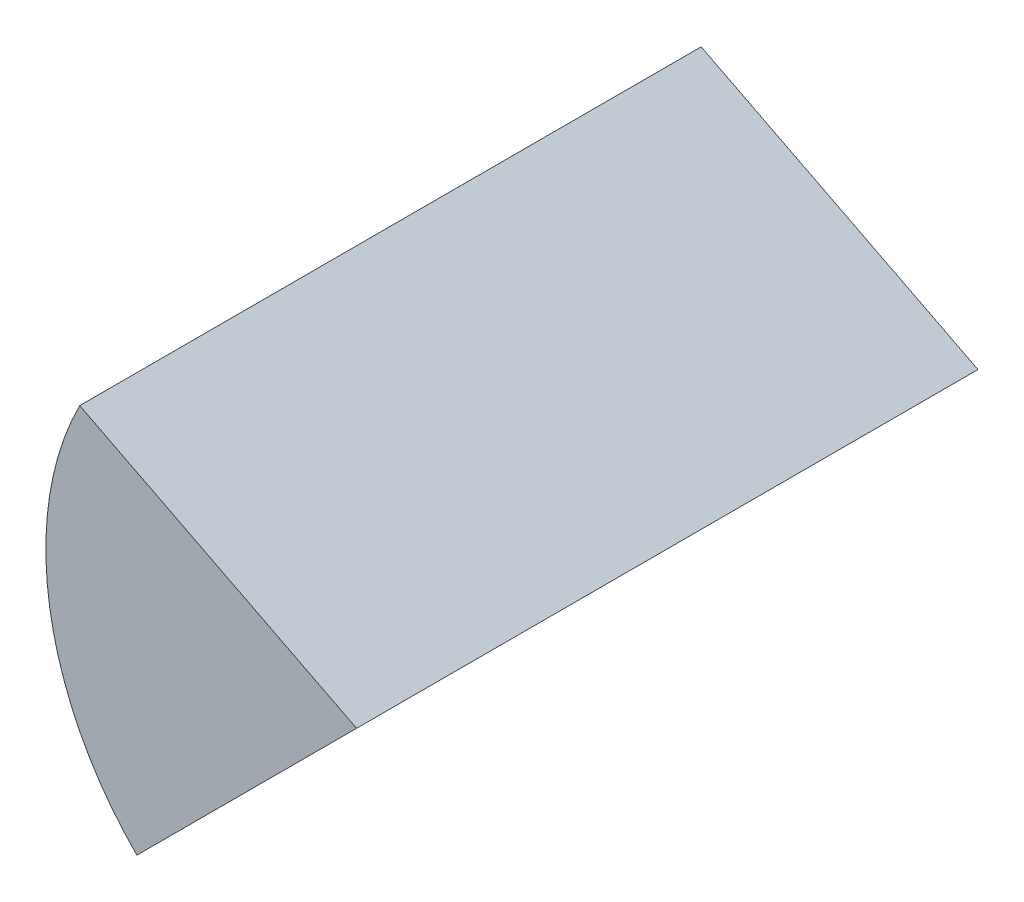
ISO-10303-21;
HEADER;
FILE_DESCRIPTION(('STEP AP214'),'2;1');
FILE_NAME('part.step','',(''),(''),'','','');
FILE_SCHEMA(('AUTOMOTIVE_DESIGN { 1 0 10303 214 1 1 1 1 }'));
ENDSEC;
DATA;
#1=APPLICATION_CONTEXT('core data for automotive mechanical design processes');
#2=APPLICATION_PROTOCOL_DEFINITION('international standard','automotive_design',2000,#1);
#3=PRODUCT_CONTEXT('',#1,'mechanical');
#4=PRODUCT('Part','Part','',(#3));
#5=PRODUCT_RELATED_PRODUCT_CATEGORY('part','',(#4));
#6=PRODUCT_DEFINITION_FORMATION('','',#4);
#7=PRODUCT_DEFINITION_CONTEXT('part definition',#1,'design');
#8=PRODUCT_DEFINITION('design','',#6,#7);
#9=PRODUCT_DEFINITION_SHAPE('','',#8);
#10=(LENGTH_UNIT() NAMED_UNIT(*) SI_UNIT(.MILLI.,.METRE.));
#11=(NAMED_UNIT(*) PLANE_ANGLE_UNIT() SI_UNIT($,.RADIAN.));
#12=(NAMED_UNIT(*) SI_UNIT($,.STERADIAN.) SOLID_ANGLE_UNIT());
#13=UNCERTAINTY_MEASURE_WITH_UNIT(LENGTH_MEASURE(1.E-05),#10,'distance_accuracy_value','');
#14=(GEOMETRIC_REPRESENTATION_CONTEXT(3) GLOBAL_UNCERTAINTY_ASSIGNED_CONTEXT((#13)) GLOBAL_UNIT_ASSIGNED_CONTEXT((#10,
#11,#12)) REPRESENTATION_CONTEXT('',''));
#15=CARTESIAN_POINT('',(0.,0.,0.));
#16=DIRECTION('',(0.,0.,1.));
#17=DIRECTION('',(1.,0.,0.));
#18=AXIS2_PLACEMENT_3D('',#15,#16,#17);
#19=CARTESIAN_POINT('',(0.,0.,50.));
#20=DIRECTION('',(-0.707106781186554,0.707106781186541,0.));
#21=DIRECTION('',(-0.707106781186541,-0.707106781186554,0.));
#22=AXIS2_PLACEMENT_3D('',#19,#20,#21);
#23=PLANE('',#22);
#24=DIRECTION('',(0.707106781186541,0.707106781186554,0.));
#25=VECTOR('',#24,1.);
#26=CARTESIAN_POINT('',(0.,0.,0.));
#27=LINE('',#26,#25);
#28=CARTESIAN_POINT('',(-17.6776695296635,-17.6776695296638,0.));
#29=VERTEX_POINT('',#28);
#30=CARTESIAN_POINT('',(0.,0.,0.));
#31=VERTEX_POINT('',#30);
#32=EDGE_CURVE('E80',#29,#31,#27,.T.);
#33=ORIENTED_EDGE('',*,*,#32,.T.);
#34=DIRECTION('',(0.,0.,-1.));
#35=VECTOR('',#34,1.);
#36=CARTESIAN_POINT('',(0.,0.,50.));
#37=LINE('',#36,#35);
#38=CARTESIAN_POINT('',(0.,0.,50.));
#39=VERTEX_POINT('',#38);
#40=EDGE_CURVE('E11',#39,#31,#37,.T.);
#41=ORIENTED_EDGE('',*,*,#40,.F.);
#42=DIRECTION('',(0.707106781186541,0.707106781186554,0.));
#43=VECTOR('',#42,1.);
#44=CARTESIAN_POINT('',(0.,0.,50.));
#45=LINE('',#44,#43);
#46=CARTESIAN_POINT('',(-17.6776695296635,-17.6776695296638,50.));
#47=VERTEX_POINT('',#46);
#48=EDGE_CURVE('E73',#47,#39,#45,.T.);
#49=ORIENTED_EDGE('',*,*,#48,.F.);
#50=DIRECTION('',(0.,0.,-1.));
#51=VECTOR('',#50,1.);
#52=CARTESIAN_POINT('',(-17.6776695296635,-17.6776695296638,50.));
#53=LINE('',#52,#51);
#54=EDGE_CURVE('E81',#47,#29,#53,.T.);
#55=ORIENTED_EDGE('',*,*,#54,.T.);
#56=EDGE_LOOP('',(#33,#41,#49,#55));
#57=FACE_BOUND('',#56,.T.);
#58=ADVANCED_FACE('F33',(#57),#23,.F.);
#59=CARTESIAN_POINT('',(0.,0.,50.));
#60=DIRECTION('',(-0.453990499739549,-0.891006524188367,0.));
#61=DIRECTION('',(0.891006524188367,-0.453990499739549,0.));
#62=AXIS2_PLACEMENT_3D('',#59,#60,#61);
#63=PLANE('',#62);
#64=DIRECTION('',(-0.891006524188367,0.453990499739549,0.));
#65=VECTOR('',#64,1.);
#66=CARTESIAN_POINT('',(0.,0.,0.));
#67=LINE('',#66,#65);
#68=CARTESIAN_POINT('',(-22.2751631047092,11.3497624934887,0.));
#69=VERTEX_POINT('',#68);
#70=EDGE_CURVE('E61',#31,#69,#67,.T.);
#71=ORIENTED_EDGE('',*,*,#70,.T.);
#72=DIRECTION('',(0.,0.,-1.));
#73=VECTOR('',#72,1.);
#74=CARTESIAN_POINT('',(-22.2751631047092,11.3497624934887,50.));
#75=LINE('',#74,#73);
#76=CARTESIAN_POINT('',(-22.2751631047092,11.3497624934887,50.));
#77=VERTEX_POINT('',#76);
#78=EDGE_CURVE('E41',#77,#69,#75,.T.);
#79=ORIENTED_EDGE('',*,*,#78,.F.);
#80=DIRECTION('',(-0.891006524188367,0.453990499739549,0.));
#81=VECTOR('',#80,1.);
#82=CARTESIAN_POINT('',(0.,0.,50.));
#83=LINE('',#82,#81);
#84=EDGE_CURVE('E69',#39,#77,#83,.T.);
#85=ORIENTED_EDGE('',*,*,#84,.F.);
#86=ORIENTED_EDGE('',*,*,#40,.T.);
#87=EDGE_LOOP('',(#71,#79,#85,#86));
#88=FACE_BOUND('',#87,.T.);
#89=ADVANCED_FACE('F70',(#88),#63,.F.);
#90=CARTESIAN_POINT('',(0.,0.,50.));
#91=DIRECTION('',(0.,0.,-1.));
#92=DIRECTION('',(-1.,0.,0.));
#93=AXIS2_PLACEMENT_3D('',#90,#91,#92);
#94=CYLINDRICAL_SURFACE('',#93,25.);
#95=CARTESIAN_POINT('',(0.,0.,0.));
#96=DIRECTION('',(0.,0.,1.));
#97=DIRECTION('',(1.,0.,0.));
#98=AXIS2_PLACEMENT_3D('',#95,#96,#97);
#99=CIRCLE('',#98,25.);
#100=EDGE_CURVE('E66',#69,#29,#99,.T.);
#101=ORIENTED_EDGE('',*,*,#100,.T.);
#102=ORIENTED_EDGE('',*,*,#54,.F.);
#103=CARTESIAN_POINT('',(0.,0.,50.));
#104=DIRECTION('',(0.,0.,1.));
#105=DIRECTION('',(1.,0.,0.));
#106=AXIS2_PLACEMENT_3D('',#103,#104,#105);
#107=CIRCLE('',#106,25.);
#108=EDGE_CURVE('E49',#77,#47,#107,.T.);
#109=ORIENTED_EDGE('',*,*,#108,.F.);
#110=ORIENTED_EDGE('',*,*,#78,.T.);
#111=EDGE_LOOP('',(#101,#102,#109,#110));
#112=FACE_BOUND('',#111,.T.);
#113=ADVANCED_FACE('F92',(#112),#94,.T.);
#114=CARTESIAN_POINT('',(0.,0.,50.));
#115=DIRECTION('',(0.,0.,1.));
#116=DIRECTION('',(1.,0.,0.));
#117=AXIS2_PLACEMENT_3D('',#114,#115,#116);
#118=PLANE('',#117);
#119=ORIENTED_EDGE('',*,*,#48,.T.);
#120=ORIENTED_EDGE('',*,*,#84,.T.);
#121=ORIENTED_EDGE('',*,*,#108,.T.);
#122=EDGE_LOOP('',(#119,#120,#121));
#123=FACE_BOUND('',#122,.T.);
#124=ADVANCED_FACE('F76',(#123),#118,.T.);
#125=CARTESIAN_POINT('',(0.,0.,0.));
#126=DIRECTION('',(0.,0.,1.));
#127=DIRECTION('',(1.,0.,0.));
#128=AXIS2_PLACEMENT_3D('',#125,#126,#127);
#129=PLANE('',#128);
#130=CARTESIAN_POINT('',(-15.3095553071056,-2.47933613383273,0.));
#131=DIRECTION('',(0.,0.,-1.));
#132=DIRECTION('',(-1.,0.,0.));
#133=AXIS2_PLACEMENT_3D('',#130,#131,#132);
#134=CIRCLE('',#133,5.);
#135=CARTESIAN_POINT('',(-20.3095553071056,-2.47933613383273,0.));
#136=VERTEX_POINT('',#135);
#137=EDGE_CURVE('E87',#136,#136,#134,.T.);
#138=ORIENTED_EDGE('',*,*,#137,.F.);
#139=EDGE_LOOP('',(#138));
#140=FACE_BOUND('',#139,.T.);
#141=ORIENTED_EDGE('',*,*,#32,.F.);
#142=ORIENTED_EDGE('',*,*,#100,.F.);
#143=ORIENTED_EDGE('',*,*,#70,.F.);
#144=EDGE_LOOP('',(#141,#142,#143));
#145=FACE_BOUND('',#144,.T.);
#146=ADVANCED_FACE('F93',(#140,#145),#129,.F.);
#147=CARTESIAN_POINT('',(-15.3095553071056,-2.47933613383273,10.));
#148=DIRECTION('',(0.,0.,-1.));
#149=DIRECTION('',(-1.,0.,0.));
#150=AXIS2_PLACEMENT_3D('',#147,#148,#149);
#151=CYLINDRICAL_SURFACE('',#150,5.);
#152=CARTESIAN_POINT('',(-15.3095553071056,-2.47933613383273,10.));
#153=DIRECTION('',(0.,0.,-1.));
#154=DIRECTION('',(-1.,0.,0.));
#155=AXIS2_PLACEMENT_3D('',#152,#153,#154);
#156=CIRCLE('',#155,5.);
#157=CARTESIAN_POINT('',(-20.3095553071056,-2.47933613383273,10.));
#158=VERTEX_POINT('',#157);
#159=EDGE_CURVE('E83',#158,#158,#156,.T.);
#160=ORIENTED_EDGE('',*,*,#159,.F.);
#161=EDGE_LOOP('',(#160));
#162=FACE_BOUND('',#161,.T.);
#163=ORIENTED_EDGE('',*,*,#137,.T.);
#164=EDGE_LOOP('',(#163));
#165=FACE_BOUND('',#164,.T.);
#166=ADVANCED_FACE('F95',(#162,#165),#151,.F.);
#167=CARTESIAN_POINT('',(-15.3095553071056,-2.47933613383273,10.));
#168=DIRECTION('',(0.,0.,-1.));
#169=DIRECTION('',(-1.,0.,0.));
#170=AXIS2_PLACEMENT_3D('',#167,#168,#169);
#171=PLANE('',#170);
#172=ORIENTED_EDGE('',*,*,#159,.T.);
#173=EDGE_LOOP('',(#172));
#174=FACE_BOUND('',#173,.T.);
#175=ADVANCED_FACE('F102',(#174),#171,.T.);
#176=CLOSED_SHELL('',(#58,#89,#113,#124,#146,#166,#175));
#177=MANIFOLD_SOLID_BREP('B2',#176);
#178=ADVANCED_BREP_SHAPE_REPRESENTATION('',(#18,#177),#14);
#179=SHAPE_DEFINITION_REPRESENTATION(#9,#178);
ENDSEC;
END-ISO-10303-21;
